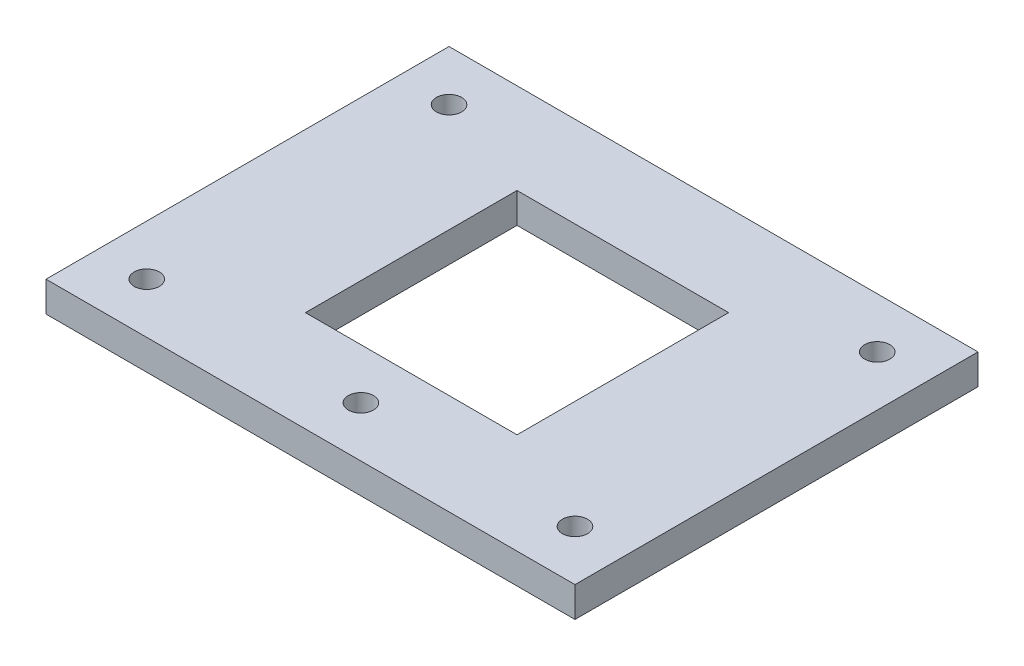
ISO-10303-21;
HEADER;
FILE_DESCRIPTION(('STEP AP214'),'2;1');
FILE_NAME('part.step','',(''),(''),'','','');
FILE_SCHEMA(('AUTOMOTIVE_DESIGN { 1 0 10303 214 1 1 1 1 }'));
ENDSEC;
DATA;
#1=APPLICATION_CONTEXT('core data for automotive mechanical design processes');
#2=APPLICATION_PROTOCOL_DEFINITION('international standard','automotive_design',2000,#1);
#3=PRODUCT_CONTEXT('',#1,'mechanical');
#4=PRODUCT('Part','Part','',(#3));
#5=PRODUCT_RELATED_PRODUCT_CATEGORY('part','',(#4));
#6=PRODUCT_DEFINITION_FORMATION('','',#4);
#7=PRODUCT_DEFINITION_CONTEXT('part definition',#1,'design');
#8=PRODUCT_DEFINITION('design','',#6,#7);
#9=PRODUCT_DEFINITION_SHAPE('','',#8);
#10=(LENGTH_UNIT() NAMED_UNIT(*) SI_UNIT(.MILLI.,.METRE.));
#11=(NAMED_UNIT(*) PLANE_ANGLE_UNIT() SI_UNIT($,.RADIAN.));
#12=(NAMED_UNIT(*) SI_UNIT($,.STERADIAN.) SOLID_ANGLE_UNIT());
#13=UNCERTAINTY_MEASURE_WITH_UNIT(LENGTH_MEASURE(1.E-05),#10,'distance_accuracy_value','');
#14=(GEOMETRIC_REPRESENTATION_CONTEXT(3) GLOBAL_UNCERTAINTY_ASSIGNED_CONTEXT((#13)) GLOBAL_UNIT_ASSIGNED_CONTEXT((#10,
#11,#12)) REPRESENTATION_CONTEXT('',''));
#15=CARTESIAN_POINT('',(0.,0.,0.));
#16=DIRECTION('',(0.,0.,1.));
#17=DIRECTION('',(1.,0.,0.));
#18=AXIS2_PLACEMENT_3D('',#15,#16,#17);
#19=CARTESIAN_POINT('',(52.5,6.,-80.));
#20=DIRECTION('',(-1.,0.,0.));
#21=DIRECTION('',(0.,0.,1.));
#22=AXIS2_PLACEMENT_3D('',#19,#20,#21);
#23=PLANE('',#22);
#24=DIRECTION('',(0.,0.,-1.));
#25=VECTOR('',#24,1.);
#26=CARTESIAN_POINT('',(52.5,0.,-80.));
#27=LINE('',#26,#25);
#28=CARTESIAN_POINT('',(52.5,0.,0.));
#29=VERTEX_POINT('',#28);
#30=CARTESIAN_POINT('',(52.5,0.,-80.));
#31=VERTEX_POINT('',#30);
#32=EDGE_CURVE('E161',#29,#31,#27,.T.);
#33=ORIENTED_EDGE('',*,*,#32,.T.);
#34=DIRECTION('',(0.,-1.,0.));
#35=VECTOR('',#34,1.);
#36=CARTESIAN_POINT('',(52.5,6.,-80.));
#37=LINE('',#36,#35);
#38=CARTESIAN_POINT('',(52.5,6.,-80.));
#39=VERTEX_POINT('',#38);
#40=EDGE_CURVE('E40',#39,#31,#37,.T.);
#41=ORIENTED_EDGE('',*,*,#40,.F.);
#42=DIRECTION('',(0.,0.,-1.));
#43=VECTOR('',#42,1.);
#44=CARTESIAN_POINT('',(52.5,6.,-80.));
#45=LINE('',#44,#43);
#46=CARTESIAN_POINT('',(52.5,6.,0.));
#47=VERTEX_POINT('',#46);
#48=EDGE_CURVE('E167',#47,#39,#45,.T.);
#49=ORIENTED_EDGE('',*,*,#48,.F.);
#50=DIRECTION('',(0.,-1.,0.));
#51=VECTOR('',#50,1.);
#52=CARTESIAN_POINT('',(52.5,6.,0.));
#53=LINE('',#52,#51);
#54=EDGE_CURVE('E11',#47,#29,#53,.T.);
#55=ORIENTED_EDGE('',*,*,#54,.T.);
#56=EDGE_LOOP('',(#33,#41,#49,#55));
#57=FACE_BOUND('',#56,.T.);
#58=ADVANCED_FACE('F33',(#57),#23,.F.);
#59=CARTESIAN_POINT('',(-52.5,6.,-80.));
#60=DIRECTION('',(0.,0.,1.));
#61=DIRECTION('',(1.,0.,0.));
#62=AXIS2_PLACEMENT_3D('',#59,#60,#61);
#63=PLANE('',#62);
#64=DIRECTION('',(-1.,0.,0.));
#65=VECTOR('',#64,1.);
#66=CARTESIAN_POINT('',(-52.5,0.,-80.));
#67=LINE('',#66,#65);
#68=CARTESIAN_POINT('',(-52.5,0.,-80.));
#69=VERTEX_POINT('',#68);
#70=EDGE_CURVE('E177',#31,#69,#67,.T.);
#71=ORIENTED_EDGE('',*,*,#70,.T.);
#72=DIRECTION('',(0.,-1.,0.));
#73=VECTOR('',#72,1.);
#74=CARTESIAN_POINT('',(-52.5,6.,-80.));
#75=LINE('',#74,#73);
#76=CARTESIAN_POINT('',(-52.5,6.,-80.));
#77=VERTEX_POINT('',#76);
#78=EDGE_CURVE('E184',#77,#69,#75,.T.);
#79=ORIENTED_EDGE('',*,*,#78,.F.);
#80=DIRECTION('',(-1.,0.,0.));
#81=VECTOR('',#80,1.);
#82=CARTESIAN_POINT('',(-52.5,6.,-80.));
#83=LINE('',#82,#81);
#84=EDGE_CURVE('E170',#39,#77,#83,.T.);
#85=ORIENTED_EDGE('',*,*,#84,.F.);
#86=ORIENTED_EDGE('',*,*,#40,.T.);
#87=EDGE_LOOP('',(#71,#79,#85,#86));
#88=FACE_BOUND('',#87,.T.);
#89=ADVANCED_FACE('F191',(#88),#63,.F.);
#90=CARTESIAN_POINT('',(-52.5,6.,0.));
#91=DIRECTION('',(1.,0.,0.));
#92=DIRECTION('',(0.,0.,-1.));
#93=AXIS2_PLACEMENT_3D('',#90,#91,#92);
#94=PLANE('',#93);
#95=DIRECTION('',(0.,0.,1.));
#96=VECTOR('',#95,1.);
#97=CARTESIAN_POINT('',(-52.5,0.,0.));
#98=LINE('',#97,#96);
#99=CARTESIAN_POINT('',(-52.5,0.,0.));
#100=VERTEX_POINT('',#99);
#101=EDGE_CURVE('E179',#69,#100,#98,.T.);
#102=ORIENTED_EDGE('',*,*,#101,.T.);
#103=DIRECTION('',(0.,-1.,0.));
#104=VECTOR('',#103,1.);
#105=CARTESIAN_POINT('',(-52.5,6.,0.));
#106=LINE('',#105,#104);
#107=CARTESIAN_POINT('',(-52.5,6.,0.));
#108=VERTEX_POINT('',#107);
#109=EDGE_CURVE('E175',#108,#100,#106,.T.);
#110=ORIENTED_EDGE('',*,*,#109,.F.);
#111=DIRECTION('',(0.,0.,1.));
#112=VECTOR('',#111,1.);
#113=CARTESIAN_POINT('',(-52.5,6.,0.));
#114=LINE('',#113,#112);
#115=EDGE_CURVE('E172',#77,#108,#114,.T.);
#116=ORIENTED_EDGE('',*,*,#115,.F.);
#117=ORIENTED_EDGE('',*,*,#78,.T.);
#118=EDGE_LOOP('',(#102,#110,#116,#117));
#119=FACE_BOUND('',#118,.T.);
#120=ADVANCED_FACE('F200',(#119),#94,.F.);
#121=CARTESIAN_POINT('',(0.,6.,0.));
#122=DIRECTION('',(0.,0.,-1.));
#123=DIRECTION('',(-1.,0.,0.));
#124=AXIS2_PLACEMENT_3D('',#121,#122,#123);
#125=PLANE('',#124);
#126=DIRECTION('',(1.,0.,0.));
#127=VECTOR('',#126,1.);
#128=CARTESIAN_POINT('',(0.,0.,0.));
#129=LINE('',#128,#127);
#130=EDGE_CURVE('E168',#100,#29,#129,.T.);
#131=ORIENTED_EDGE('',*,*,#130,.T.);
#132=ORIENTED_EDGE('',*,*,#54,.F.);
#133=DIRECTION('',(1.,0.,0.));
#134=VECTOR('',#133,1.);
#135=CARTESIAN_POINT('',(52.5,6.,0.));
#136=LINE('',#135,#134);
#137=EDGE_CURVE('E164',#108,#47,#136,.T.);
#138=ORIENTED_EDGE('',*,*,#137,.F.);
#139=ORIENTED_EDGE('',*,*,#109,.T.);
#140=EDGE_LOOP('',(#131,#132,#138,#139));
#141=FACE_BOUND('',#140,.T.);
#142=ADVANCED_FACE('F203',(#141),#125,.F.);
#143=CARTESIAN_POINT('',(0.,6.,0.));
#144=DIRECTION('',(0.,-1.,0.));
#145=DIRECTION('',(0.,0.,-1.));
#146=AXIS2_PLACEMENT_3D('',#143,#144,#145);
#147=PLANE('',#146);
#148=DIRECTION('',(1.,0.,0.));
#149=VECTOR('',#148,1.);
#150=CARTESIAN_POINT('',(21.,6.,-20.));
#151=LINE('',#150,#149);
#152=CARTESIAN_POINT('',(-21.,6.,-20.));
#153=VERTEX_POINT('',#152);
#154=CARTESIAN_POINT('',(21.,6.,-20.));
#155=VERTEX_POINT('',#154);
#156=EDGE_CURVE('E124',#153,#155,#151,.T.);
#157=ORIENTED_EDGE('',*,*,#156,.F.);
#158=DIRECTION('',(0.,0.,1.));
#159=VECTOR('',#158,1.);
#160=CARTESIAN_POINT('',(-21.,6.,-20.));
#161=LINE('',#160,#159);
#162=CARTESIAN_POINT('',(-21.,6.,-62.));
#163=VERTEX_POINT('',#162);
#164=EDGE_CURVE('E47',#163,#153,#161,.T.);
#165=ORIENTED_EDGE('',*,*,#164,.F.);
#166=DIRECTION('',(-1.,0.,0.));
#167=VECTOR('',#166,1.);
#168=CARTESIAN_POINT('',(21.,6.,-62.));
#169=LINE('',#168,#167);
#170=CARTESIAN_POINT('',(21.,6.,-62.));
#171=VERTEX_POINT('',#170);
#172=EDGE_CURVE('E115',#171,#163,#169,.T.);
#173=ORIENTED_EDGE('',*,*,#172,.F.);
#174=DIRECTION('',(0.,0.,-1.));
#175=VECTOR('',#174,1.);
#176=CARTESIAN_POINT('',(21.,6.,-20.));
#177=LINE('',#176,#175);
#178=EDGE_CURVE('E118',#155,#171,#177,.T.);
#179=ORIENTED_EDGE('',*,*,#178,.F.);
#180=EDGE_LOOP('',(#157,#165,#173,#179));
#181=FACE_BOUND('',#180,.T.);
#182=CARTESIAN_POINT('',(-42.5,6.,-9.99999999999999));
#183=DIRECTION('',(0.,1.,0.));
#184=DIRECTION('',(0.,0.,1.));
#185=AXIS2_PLACEMENT_3D('',#182,#183,#184);
#186=CIRCLE('',#185,2.5);
#187=CARTESIAN_POINT('',(-42.5,6.,-7.49999999999999));
#188=VERTEX_POINT('',#187);
#189=EDGE_CURVE('E130',#188,#188,#186,.T.);
#190=ORIENTED_EDGE('',*,*,#189,.F.);
#191=EDGE_LOOP('',(#190));
#192=FACE_BOUND('',#191,.T.);
#193=CARTESIAN_POINT('',(0.,6.,-9.99999999999999));
#194=DIRECTION('',(0.,1.,0.));
#195=DIRECTION('',(0.,0.,1.));
#196=AXIS2_PLACEMENT_3D('',#193,#194,#195);
#197=CIRCLE('',#196,2.5);
#198=CARTESIAN_POINT('',(0.,6.,-7.49999999999999));
#199=VERTEX_POINT('',#198);
#200=EDGE_CURVE('E137',#199,#199,#197,.T.);
#201=ORIENTED_EDGE('',*,*,#200,.F.);
#202=EDGE_LOOP('',(#201));
#203=FACE_BOUND('',#202,.T.);
#204=CARTESIAN_POINT('',(42.5,6.,-9.99999999999999));
#205=DIRECTION('',(0.,1.,0.));
#206=DIRECTION('',(0.,0.,1.));
#207=AXIS2_PLACEMENT_3D('',#204,#205,#206);
#208=CIRCLE('',#207,2.5);
#209=CARTESIAN_POINT('',(42.5,6.,-7.49999999999999));
#210=VERTEX_POINT('',#209);
#211=EDGE_CURVE('E143',#210,#210,#208,.T.);
#212=ORIENTED_EDGE('',*,*,#211,.F.);
#213=EDGE_LOOP('',(#212));
#214=FACE_BOUND('',#213,.T.);
#215=CARTESIAN_POINT('',(42.5,6.,-70.));
#216=DIRECTION('',(0.,1.,0.));
#217=DIRECTION('',(0.,0.,1.));
#218=AXIS2_PLACEMENT_3D('',#215,#216,#217);
#219=CIRCLE('',#218,2.5);
#220=CARTESIAN_POINT('',(42.5,6.,-67.5));
#221=VERTEX_POINT('',#220);
#222=EDGE_CURVE('E149',#221,#221,#219,.T.);
#223=ORIENTED_EDGE('',*,*,#222,.F.);
#224=EDGE_LOOP('',(#223));
#225=FACE_BOUND('',#224,.T.);
#226=CARTESIAN_POINT('',(-42.5,6.,-70.));
#227=DIRECTION('',(0.,1.,0.));
#228=DIRECTION('',(0.,0.,1.));
#229=AXIS2_PLACEMENT_3D('',#226,#227,#228);
#230=CIRCLE('',#229,2.5);
#231=CARTESIAN_POINT('',(-42.5,6.,-67.5));
#232=VERTEX_POINT('',#231);
#233=EDGE_CURVE('E155',#232,#232,#230,.T.);
#234=ORIENTED_EDGE('',*,*,#233,.F.);
#235=EDGE_LOOP('',(#234));
#236=FACE_BOUND('',#235,.T.);
#237=ORIENTED_EDGE('',*,*,#137,.T.);
#238=ORIENTED_EDGE('',*,*,#48,.T.);
#239=ORIENTED_EDGE('',*,*,#84,.T.);
#240=ORIENTED_EDGE('',*,*,#115,.T.);
#241=EDGE_LOOP('',(#237,#238,#239,#240));
#242=FACE_BOUND('',#241,.T.);
#243=ADVANCED_FACE('F206',(#181,#192,#203,#214,#225,#236,#242),#147,.F.);
#244=CARTESIAN_POINT('',(0.,0.,0.));
#245=DIRECTION('',(0.,-1.,0.));
#246=DIRECTION('',(0.,0.,-1.));
#247=AXIS2_PLACEMENT_3D('',#244,#245,#246);
#248=PLANE('',#247);
#249=DIRECTION('',(0.,0.,1.));
#250=VECTOR('',#249,1.);
#251=CARTESIAN_POINT('',(-21.,0.,-20.));
#252=LINE('',#251,#250);
#253=CARTESIAN_POINT('',(-21.,0.,-62.));
#254=VERTEX_POINT('',#253);
#255=CARTESIAN_POINT('',(-21.,0.,-20.));
#256=VERTEX_POINT('',#255);
#257=EDGE_CURVE('E99',#254,#256,#252,.T.);
#258=ORIENTED_EDGE('',*,*,#257,.T.);
#259=DIRECTION('',(1.,0.,0.));
#260=VECTOR('',#259,1.);
#261=CARTESIAN_POINT('',(21.,0.,-20.));
#262=LINE('',#261,#260);
#263=CARTESIAN_POINT('',(21.,0.,-20.));
#264=VERTEX_POINT('',#263);
#265=EDGE_CURVE('E108',#256,#264,#262,.T.);
#266=ORIENTED_EDGE('',*,*,#265,.T.);
#267=DIRECTION('',(0.,0.,-1.));
#268=VECTOR('',#267,1.);
#269=CARTESIAN_POINT('',(21.,0.,-20.));
#270=LINE('',#269,#268);
#271=CARTESIAN_POINT('',(21.,0.,-62.));
#272=VERTEX_POINT('',#271);
#273=EDGE_CURVE('E55',#264,#272,#270,.T.);
#274=ORIENTED_EDGE('',*,*,#273,.T.);
#275=DIRECTION('',(-1.,0.,0.));
#276=VECTOR('',#275,1.);
#277=CARTESIAN_POINT('',(21.,0.,-62.));
#278=LINE('',#277,#276);
#279=EDGE_CURVE('E105',#272,#254,#278,.T.);
#280=ORIENTED_EDGE('',*,*,#279,.T.);
#281=EDGE_LOOP('',(#258,#266,#274,#280));
#282=FACE_BOUND('',#281,.T.);
#283=CARTESIAN_POINT('',(-42.5,0.,-9.99999999999999));
#284=DIRECTION('',(0.,1.,0.));
#285=DIRECTION('',(0.,0.,1.));
#286=AXIS2_PLACEMENT_3D('',#283,#284,#285);
#287=CIRCLE('',#286,2.5);
#288=CARTESIAN_POINT('',(-42.5,0.,-7.49999999999999));
#289=VERTEX_POINT('',#288);
#290=EDGE_CURVE('E134',#289,#289,#287,.T.);
#291=ORIENTED_EDGE('',*,*,#290,.T.);
#292=EDGE_LOOP('',(#291));
#293=FACE_BOUND('',#292,.T.);
#294=CARTESIAN_POINT('',(0.,0.,-9.99999999999999));
#295=DIRECTION('',(0.,1.,0.));
#296=DIRECTION('',(0.,0.,1.));
#297=AXIS2_PLACEMENT_3D('',#294,#295,#296);
#298=CIRCLE('',#297,2.5);
#299=CARTESIAN_POINT('',(0.,0.,-7.49999999999999));
#300=VERTEX_POINT('',#299);
#301=EDGE_CURVE('E140',#300,#300,#298,.T.);
#302=ORIENTED_EDGE('',*,*,#301,.T.);
#303=EDGE_LOOP('',(#302));
#304=FACE_BOUND('',#303,.T.);
#305=CARTESIAN_POINT('',(42.5,0.,-9.99999999999999));
#306=DIRECTION('',(0.,1.,0.));
#307=DIRECTION('',(0.,0.,1.));
#308=AXIS2_PLACEMENT_3D('',#305,#306,#307);
#309=CIRCLE('',#308,2.5);
#310=CARTESIAN_POINT('',(42.5,0.,-7.49999999999999));
#311=VERTEX_POINT('',#310);
#312=EDGE_CURVE('E146',#311,#311,#309,.T.);
#313=ORIENTED_EDGE('',*,*,#312,.T.);
#314=EDGE_LOOP('',(#313));
#315=FACE_BOUND('',#314,.T.);
#316=CARTESIAN_POINT('',(42.5,0.,-70.));
#317=DIRECTION('',(0.,1.,0.));
#318=DIRECTION('',(0.,0.,1.));
#319=AXIS2_PLACEMENT_3D('',#316,#317,#318);
#320=CIRCLE('',#319,2.5);
#321=CARTESIAN_POINT('',(42.5,0.,-67.5));
#322=VERTEX_POINT('',#321);
#323=EDGE_CURVE('E152',#322,#322,#320,.T.);
#324=ORIENTED_EDGE('',*,*,#323,.T.);
#325=EDGE_LOOP('',(#324));
#326=FACE_BOUND('',#325,.T.);
#327=CARTESIAN_POINT('',(-42.5,0.,-70.));
#328=DIRECTION('',(0.,1.,0.));
#329=DIRECTION('',(0.,0.,1.));
#330=AXIS2_PLACEMENT_3D('',#327,#328,#329);
#331=CIRCLE('',#330,2.5);
#332=CARTESIAN_POINT('',(-42.5,0.,-67.5));
#333=VERTEX_POINT('',#332);
#334=EDGE_CURVE('E158',#333,#333,#331,.T.);
#335=ORIENTED_EDGE('',*,*,#334,.T.);
#336=EDGE_LOOP('',(#335));
#337=FACE_BOUND('',#336,.T.);
#338=ORIENTED_EDGE('',*,*,#32,.F.);
#339=ORIENTED_EDGE('',*,*,#130,.F.);
#340=ORIENTED_EDGE('',*,*,#101,.F.);
#341=ORIENTED_EDGE('',*,*,#70,.F.);
#342=EDGE_LOOP('',(#338,#339,#340,#341));
#343=FACE_BOUND('',#342,.T.);
#344=ADVANCED_FACE('F112',(#282,#293,#304,#315,#326,#337,#343),#248,.T.);
#345=CARTESIAN_POINT('',(-42.5,0.,-70.));
#346=DIRECTION('',(0.,1.,0.));
#347=DIRECTION('',(0.,0.,1.));
#348=AXIS2_PLACEMENT_3D('',#345,#346,#347);
#349=CYLINDRICAL_SURFACE('',#348,2.5);
#350=ORIENTED_EDGE('',*,*,#334,.F.);
#351=EDGE_LOOP('',(#350));
#352=FACE_BOUND('',#351,.T.);
#353=ORIENTED_EDGE('',*,*,#233,.T.);
#354=EDGE_LOOP('',(#353));
#355=FACE_BOUND('',#354,.T.);
#356=ADVANCED_FACE('F220',(#352,#355),#349,.F.);
#357=CARTESIAN_POINT('',(42.5,0.,-70.));
#358=DIRECTION('',(0.,1.,0.));
#359=DIRECTION('',(0.,0.,1.));
#360=AXIS2_PLACEMENT_3D('',#357,#358,#359);
#361=CYLINDRICAL_SURFACE('',#360,2.5);
#362=ORIENTED_EDGE('',*,*,#323,.F.);
#363=EDGE_LOOP('',(#362));
#364=FACE_BOUND('',#363,.T.);
#365=ORIENTED_EDGE('',*,*,#222,.T.);
#366=EDGE_LOOP('',(#365));
#367=FACE_BOUND('',#366,.T.);
#368=ADVANCED_FACE('F226',(#364,#367),#361,.F.);
#369=CARTESIAN_POINT('',(42.5,0.,-9.99999999999999));
#370=DIRECTION('',(0.,1.,0.));
#371=DIRECTION('',(0.,0.,1.));
#372=AXIS2_PLACEMENT_3D('',#369,#370,#371);
#373=CYLINDRICAL_SURFACE('',#372,2.5);
#374=ORIENTED_EDGE('',*,*,#312,.F.);
#375=EDGE_LOOP('',(#374));
#376=FACE_BOUND('',#375,.T.);
#377=ORIENTED_EDGE('',*,*,#211,.T.);
#378=EDGE_LOOP('',(#377));
#379=FACE_BOUND('',#378,.T.);
#380=ADVANCED_FACE('F230',(#376,#379),#373,.F.);
#381=CARTESIAN_POINT('',(0.,0.,-9.99999999999999));
#382=DIRECTION('',(0.,1.,0.));
#383=DIRECTION('',(0.,0.,1.));
#384=AXIS2_PLACEMENT_3D('',#381,#382,#383);
#385=CYLINDRICAL_SURFACE('',#384,2.5);
#386=ORIENTED_EDGE('',*,*,#301,.F.);
#387=EDGE_LOOP('',(#386));
#388=FACE_BOUND('',#387,.T.);
#389=ORIENTED_EDGE('',*,*,#200,.T.);
#390=EDGE_LOOP('',(#389));
#391=FACE_BOUND('',#390,.T.);
#392=ADVANCED_FACE('F234',(#388,#391),#385,.F.);
#393=CARTESIAN_POINT('',(-42.5,0.,-9.99999999999999));
#394=DIRECTION('',(0.,1.,0.));
#395=DIRECTION('',(0.,0.,1.));
#396=AXIS2_PLACEMENT_3D('',#393,#394,#395);
#397=CYLINDRICAL_SURFACE('',#396,2.5);
#398=ORIENTED_EDGE('',*,*,#290,.F.);
#399=EDGE_LOOP('',(#398));
#400=FACE_BOUND('',#399,.T.);
#401=ORIENTED_EDGE('',*,*,#189,.T.);
#402=EDGE_LOOP('',(#401));
#403=FACE_BOUND('',#402,.T.);
#404=ADVANCED_FACE('F238',(#400,#403),#397,.F.);
#405=CARTESIAN_POINT('',(-21.,0.,-20.));
#406=DIRECTION('',(-1.,0.,0.));
#407=DIRECTION('',(0.,0.,1.));
#408=AXIS2_PLACEMENT_3D('',#405,#406,#407);
#409=PLANE('',#408);
#410=ORIENTED_EDGE('',*,*,#164,.T.);
#411=DIRECTION('',(0.,1.,0.));
#412=VECTOR('',#411,1.);
#413=CARTESIAN_POINT('',(-21.,0.,-20.));
#414=LINE('',#413,#412);
#415=EDGE_CURVE('E95',#256,#153,#414,.T.);
#416=ORIENTED_EDGE('',*,*,#415,.F.);
#417=ORIENTED_EDGE('',*,*,#257,.F.);
#418=DIRECTION('',(0.,1.,0.));
#419=VECTOR('',#418,1.);
#420=CARTESIAN_POINT('',(-21.,0.,-62.));
#421=LINE('',#420,#419);
#422=EDGE_CURVE('E128',#254,#163,#421,.T.);
#423=ORIENTED_EDGE('',*,*,#422,.T.);
#424=EDGE_LOOP('',(#410,#416,#417,#423));
#425=FACE_BOUND('',#424,.T.);
#426=ADVANCED_FACE('F97',(#425),#409,.F.);
#427=CARTESIAN_POINT('',(21.,0.,-62.));
#428=DIRECTION('',(0.,0.,-1.));
#429=DIRECTION('',(-1.,0.,0.));
#430=AXIS2_PLACEMENT_3D('',#427,#428,#429);
#431=PLANE('',#430);
#432=ORIENTED_EDGE('',*,*,#172,.T.);
#433=ORIENTED_EDGE('',*,*,#422,.F.);
#434=ORIENTED_EDGE('',*,*,#279,.F.);
#435=DIRECTION('',(0.,1.,0.));
#436=VECTOR('',#435,1.);
#437=CARTESIAN_POINT('',(21.,0.,-62.));
#438=LINE('',#437,#436);
#439=EDGE_CURVE('E131',#272,#171,#438,.T.);
#440=ORIENTED_EDGE('',*,*,#439,.T.);
#441=EDGE_LOOP('',(#432,#433,#434,#440));
#442=FACE_BOUND('',#441,.T.);
#443=ADVANCED_FACE('F245',(#442),#431,.F.);
#444=CARTESIAN_POINT('',(21.,0.,-20.));
#445=DIRECTION('',(1.,0.,0.));
#446=DIRECTION('',(0.,0.,-1.));
#447=AXIS2_PLACEMENT_3D('',#444,#445,#446);
#448=PLANE('',#447);
#449=ORIENTED_EDGE('',*,*,#178,.T.);
#450=ORIENTED_EDGE('',*,*,#439,.F.);
#451=ORIENTED_EDGE('',*,*,#273,.F.);
#452=DIRECTION('',(0.,1.,0.));
#453=VECTOR('',#452,1.);
#454=CARTESIAN_POINT('',(21.,0.,-20.));
#455=LINE('',#454,#453);
#456=EDGE_CURVE('E104',#264,#155,#455,.T.);
#457=ORIENTED_EDGE('',*,*,#456,.T.);
#458=EDGE_LOOP('',(#449,#450,#451,#457));
#459=FACE_BOUND('',#458,.T.);
#460=ADVANCED_FACE('F248',(#459),#448,.F.);
#461=CARTESIAN_POINT('',(21.,0.,-20.));
#462=DIRECTION('',(0.,0.,1.));
#463=DIRECTION('',(1.,0.,0.));
#464=AXIS2_PLACEMENT_3D('',#461,#462,#463);
#465=PLANE('',#464);
#466=ORIENTED_EDGE('',*,*,#156,.T.);
#467=ORIENTED_EDGE('',*,*,#456,.F.);
#468=ORIENTED_EDGE('',*,*,#265,.F.);
#469=ORIENTED_EDGE('',*,*,#415,.T.);
#470=EDGE_LOOP('',(#466,#467,#468,#469));
#471=FACE_BOUND('',#470,.T.);
#472=ADVANCED_FACE('F109',(#471),#465,.F.);
#473=CLOSED_SHELL('',(#58,#89,#120,#142,#243,#344,#356,#368,#380,#392,#404,#426,#443,#460,#472));
#474=MANIFOLD_SOLID_BREP('B2',#473);
#475=ADVANCED_BREP_SHAPE_REPRESENTATION('',(#18,#474),#14);
#476=SHAPE_DEFINITION_REPRESENTATION(#9,#475);
ENDSEC;
END-ISO-10303-21;
